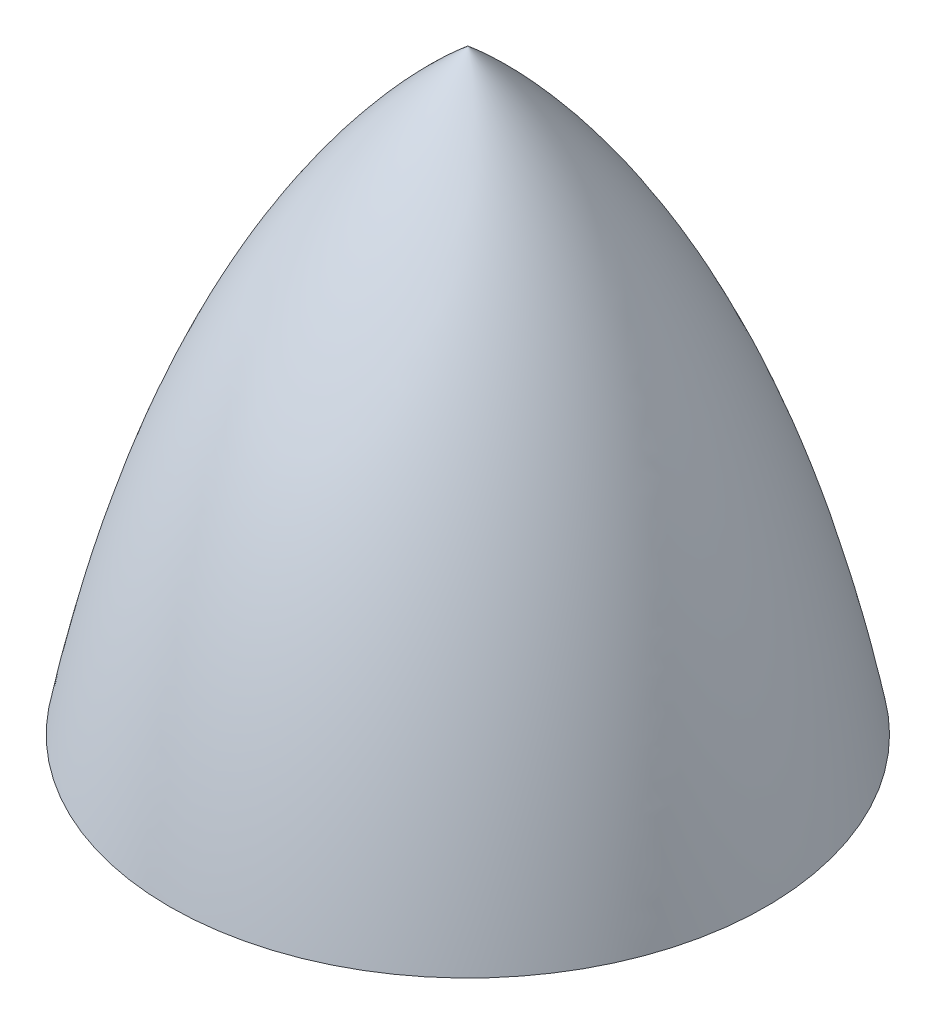
ISO-10303-21;
HEADER;
FILE_DESCRIPTION(('STEP AP214'),'2;1');
FILE_NAME('part.step','',(''),(''),'','','');
FILE_SCHEMA(('AUTOMOTIVE_DESIGN { 1 0 10303 214 1 1 1 1 }'));
ENDSEC;
DATA;
#1=APPLICATION_CONTEXT('core data for automotive mechanical design processes');
#2=APPLICATION_PROTOCOL_DEFINITION('international standard','automotive_design',2000,#1);
#3=PRODUCT_CONTEXT('',#1,'mechanical');
#4=PRODUCT('Part','Part','',(#3));
#5=PRODUCT_RELATED_PRODUCT_CATEGORY('part','',(#4));
#6=PRODUCT_DEFINITION_FORMATION('','',#4);
#7=PRODUCT_DEFINITION_CONTEXT('part definition',#1,'design');
#8=PRODUCT_DEFINITION('design','',#6,#7);
#9=PRODUCT_DEFINITION_SHAPE('','',#8);
#10=(LENGTH_UNIT() NAMED_UNIT(*) SI_UNIT(.MILLI.,.METRE.));
#11=(NAMED_UNIT(*) PLANE_ANGLE_UNIT() SI_UNIT($,.RADIAN.));
#12=(NAMED_UNIT(*) SI_UNIT($,.STERADIAN.) SOLID_ANGLE_UNIT());
#13=UNCERTAINTY_MEASURE_WITH_UNIT(LENGTH_MEASURE(1.E-05),#10,'distance_accuracy_value','');
#14=(GEOMETRIC_REPRESENTATION_CONTEXT(3) GLOBAL_UNCERTAINTY_ASSIGNED_CONTEXT((#13)) GLOBAL_UNIT_ASSIGNED_CONTEXT((#10,
#11,#12)) REPRESENTATION_CONTEXT('',''));
#15=CARTESIAN_POINT('',(0.,0.,0.));
#16=DIRECTION('',(0.,0.,1.));
#17=DIRECTION('',(1.,0.,0.));
#18=AXIS2_PLACEMENT_3D('',#15,#16,#17);
#19=CARTESIAN_POINT('',(0.,0.,0.));
#20=DIRECTION('',(0.,-1.,0.));
#21=DIRECTION('',(0.,0.,-1.));
#22=AXIS2_PLACEMENT_3D('',#19,#20,#21);
#23=PLANE('',#22);
#24=CARTESIAN_POINT('',(0.,0.,0.));
#25=DIRECTION('',(0.,1.,0.));
#26=DIRECTION('',(0.,0.,1.));
#27=AXIS2_PLACEMENT_3D('',#24,#25,#26);
#28=CIRCLE('',#27,48.2135201925641);
#29=CARTESIAN_POINT('',(0.,0.,48.2135201925641));
#30=VERTEX_POINT('',#29);
#31=EDGE_CURVE('E64',#30,#30,#28,.T.);
#32=ORIENTED_EDGE('',*,*,#31,.T.);
#33=EDGE_LOOP('',(#32));
#34=FACE_BOUND('',#33,.T.);
#35=CARTESIAN_POINT('',(0.,0.,0.));
#36=DIRECTION('',(0.,1.,0.));
#37=DIRECTION('',(0.,0.,1.));
#38=AXIS2_PLACEMENT_3D('',#35,#36,#37);
#39=CIRCLE('',#38,50.8);
#40=CARTESIAN_POINT('',(0.,0.,50.8));
#41=VERTEX_POINT('',#40);
#42=EDGE_CURVE('E13',#41,#41,#39,.T.);
#43=ORIENTED_EDGE('',*,*,#42,.F.);
#44=EDGE_LOOP('',(#43));
#45=FACE_BOUND('',#44,.T.);
#46=ADVANCED_FACE('F57',(#34,#45),#23,.T.);
#47=CARTESIAN_POINT('',(0.,101.6,0.));
#48=CARTESIAN_POINT('',(-29.6989105769859,76.3338102075386,0.));
#49=CARTESIAN_POINT('',(-43.6839973281304,37.1735347279278,0.));
#50=CARTESIAN_POINT('',(-50.8,0.,0.));
#51=B_SPLINE_CURVE_WITH_KNOTS('',3,(#47,#48,#49,#50),.UNSPECIFIED.,.F.,.F.,(4,4),(0.,1.),.UNSPECIFIED.);
#52=CARTESIAN_POINT('',(0.,0.,0.));
#53=DIRECTION('',(0.,1.,0.));
#54=AXIS1_PLACEMENT('',#52,#53);
#55=SURFACE_OF_REVOLUTION('',#51,#54);
#56=ORIENTED_EDGE('',*,*,#42,.T.);
#57=EDGE_LOOP('',(#56));
#58=FACE_BOUND('',#57,.T.);
#59=CARTESIAN_POINT('',(0.,101.6,0.));
#60=VERTEX_POINT('',#59);
#61=VERTEX_LOOP('',#60);
#62=FACE_BOUND('',#61,.T.);
#63=ADVANCED_FACE('F73',(#58,#62),#55,.F.);
#64=CARTESIAN_POINT('',(-1.6846674491775,100.137102314013,0.));
#65=CARTESIAN_POINT('',(-30.2306527287613,74.83856234684,0.));
#66=CARTESIAN_POINT('',(-43.8199175373784,36.4634964028048,0.));
#67=CARTESIAN_POINT('',(-50.8,0.,0.));
#68=B_SPLINE_CURVE_WITH_KNOTS('',3,(#64,#65,#66,#67),.UNSPECIFIED.,.F.,.F.,(4,4),
(0.0191006405583913,1.),.UNSPECIFIED.);
#69=CARTESIAN_POINT('',(0.,0.,0.));
#70=DIRECTION('',(0.,1.,0.));
#71=AXIS1_PLACEMENT('',#69,#70);
#72=SURFACE_OF_REVOLUTION('',#68,#71);
#73=OFFSET_SURFACE('',#72,2.54,.F.);
#74=CARTESIAN_POINT('',(0.,98.2361826456207,0.));
#75=VERTEX_POINT('',#74);
#76=VERTEX_LOOP('',#75);
#77=FACE_BOUND('',#76,.T.);
#78=ORIENTED_EDGE('',*,*,#31,.F.);
#79=EDGE_LOOP('',(#78));
#80=FACE_BOUND('',#79,.T.);
#81=ADVANCED_FACE('F70',(#77,#80),#73,.T.);
#82=CLOSED_SHELL('',(#46,#63,#81));
#83=MANIFOLD_SOLID_BREP('B2',#82);
#84=ADVANCED_BREP_SHAPE_REPRESENTATION('',(#18,#83),#14);
#85=SHAPE_DEFINITION_REPRESENTATION(#9,#84);
ENDSEC;
END-ISO-10303-21;
